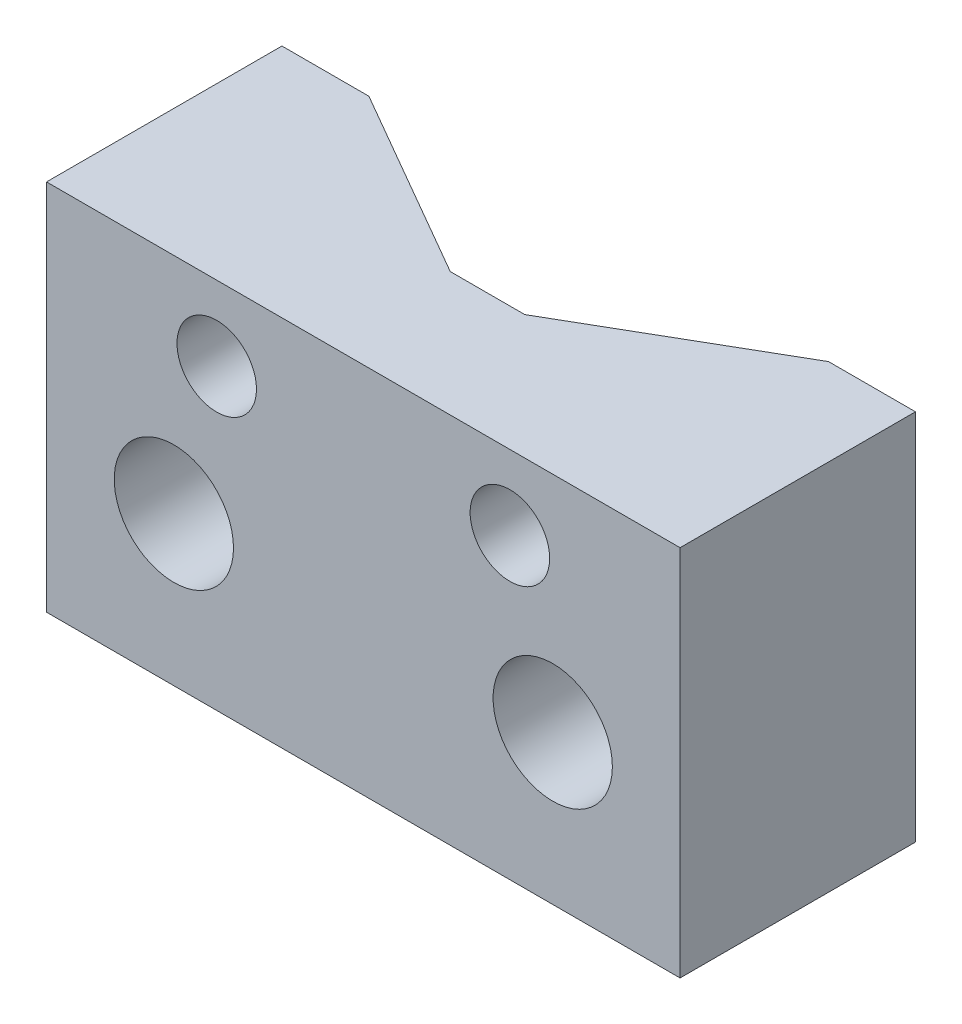
ISO-10303-21;
HEADER;
FILE_DESCRIPTION(('STEP AP214'),'2;1');
FILE_NAME('part.step','',(''),(''),'','','');
FILE_SCHEMA(('AUTOMOTIVE_DESIGN { 1 0 10303 214 1 1 1 1 }'));
ENDSEC;
DATA;
#1=APPLICATION_CONTEXT('core data for automotive mechanical design processes');
#2=APPLICATION_PROTOCOL_DEFINITION('international standard','automotive_design',2000,#1);
#3=PRODUCT_CONTEXT('',#1,'mechanical');
#4=PRODUCT('Part','Part','',(#3));
#5=PRODUCT_RELATED_PRODUCT_CATEGORY('part','',(#4));
#6=PRODUCT_DEFINITION_FORMATION('','',#4);
#7=PRODUCT_DEFINITION_CONTEXT('part definition',#1,'design');
#8=PRODUCT_DEFINITION('design','',#6,#7);
#9=PRODUCT_DEFINITION_SHAPE('','',#8);
#10=(LENGTH_UNIT() NAMED_UNIT(*) SI_UNIT(.MILLI.,.METRE.));
#11=(NAMED_UNIT(*) PLANE_ANGLE_UNIT() SI_UNIT($,.RADIAN.));
#12=(NAMED_UNIT(*) SI_UNIT($,.STERADIAN.) SOLID_ANGLE_UNIT());
#13=UNCERTAINTY_MEASURE_WITH_UNIT(LENGTH_MEASURE(1.E-05),#10,'distance_accuracy_value','');
#14=(GEOMETRIC_REPRESENTATION_CONTEXT(3) GLOBAL_UNCERTAINTY_ASSIGNED_CONTEXT((#13)) GLOBAL_UNIT_ASSIGNED_CONTEXT((#10,
#11,#12)) REPRESENTATION_CONTEXT('',''));
#15=CARTESIAN_POINT('',(0.,0.,0.));
#16=DIRECTION('',(0.,0.,1.));
#17=DIRECTION('',(1.,0.,0.));
#18=AXIS2_PLACEMENT_3D('',#15,#16,#17);
#19=CARTESIAN_POINT('',(12.75,15.,-9.47446458621961));
#20=DIRECTION('',(-1.,0.,0.));
#21=DIRECTION('',(0.,0.,1.));
#22=AXIS2_PLACEMENT_3D('',#19,#20,#21);
#23=PLANE('',#22);
#24=DIRECTION('',(0.,0.,-1.));
#25=VECTOR('',#24,1.);
#26=CARTESIAN_POINT('',(12.75,0.,-9.47446458621961));
#27=LINE('',#26,#25);
#28=CARTESIAN_POINT('',(12.75,0.,0.));
#29=VERTEX_POINT('',#28);
#30=CARTESIAN_POINT('',(12.75,0.,-9.47446458621961));
#31=VERTEX_POINT('',#30);
#32=EDGE_CURVE('E158',#29,#31,#27,.T.);
#33=ORIENTED_EDGE('',*,*,#32,.T.);
#34=DIRECTION('',(0.,-1.,0.));
#35=VECTOR('',#34,1.);
#36=CARTESIAN_POINT('',(12.75,15.,-9.47446458621961));
#37=LINE('',#36,#35);
#38=CARTESIAN_POINT('',(12.75,15.,-9.47446458621961));
#39=VERTEX_POINT('',#38);
#40=EDGE_CURVE('E40',#39,#31,#37,.T.);
#41=ORIENTED_EDGE('',*,*,#40,.F.);
#42=DIRECTION('',(0.,0.,-1.));
#43=VECTOR('',#42,1.);
#44=CARTESIAN_POINT('',(12.75,15.,-9.47446458621961));
#45=LINE('',#44,#43);
#46=CARTESIAN_POINT('',(12.75,15.,0.));
#47=VERTEX_POINT('',#46);
#48=EDGE_CURVE('E195',#47,#39,#45,.T.);
#49=ORIENTED_EDGE('',*,*,#48,.F.);
#50=DIRECTION('',(0.,-1.,0.));
#51=VECTOR('',#50,1.);
#52=CARTESIAN_POINT('',(12.75,15.,0.));
#53=LINE('',#52,#51);
#54=EDGE_CURVE('E11',#47,#29,#53,.T.);
#55=ORIENTED_EDGE('',*,*,#54,.T.);
#56=EDGE_LOOP('',(#33,#41,#49,#55));
#57=FACE_BOUND('',#56,.T.);
#58=ADVANCED_FACE('F33',(#57),#23,.F.);
#59=CARTESIAN_POINT('',(9.25,15.,-9.47446458621961));
#60=DIRECTION('',(0.,0.,1.));
#61=DIRECTION('',(1.,0.,0.));
#62=AXIS2_PLACEMENT_3D('',#59,#60,#61);
#63=PLANE('',#62);
#64=DIRECTION('',(0.,-1.,0.));
#65=VECTOR('',#64,1.);
#66=CARTESIAN_POINT('',(9.25,15.,-9.47446458621961));
#67=LINE('',#66,#65);
#68=CARTESIAN_POINT('',(9.25,4.233824753882,-9.47446458621961));
#69=VERTEX_POINT('',#68);
#70=CARTESIAN_POINT('',(9.25,0.,-9.47446458621961));
#71=VERTEX_POINT('',#70);
#72=EDGE_CURVE('E137',#69,#71,#67,.T.);
#73=ORIENTED_EDGE('',*,*,#72,.F.);
#74=CARTESIAN_POINT('',(7.625,6.,-9.47446458621961));
#75=DIRECTION('',(0.,0.,1.));
#76=DIRECTION('',(1.,0.,0.));
#77=AXIS2_PLACEMENT_3D('',#74,#75,#76);
#78=CIRCLE('',#77,2.4);
#79=CARTESIAN_POINT('',(9.25,7.766175246118,-9.47446458621961));
#80=VERTEX_POINT('',#79);
#81=EDGE_CURVE('E46',#69,#80,#78,.T.);
#82=ORIENTED_EDGE('',*,*,#81,.T.);
#83=CARTESIAN_POINT('',(9.25,15.,-9.47446458621961));
#84=VERTEX_POINT('',#83);
#85=EDGE_CURVE('E138',#84,#80,#67,.T.);
#86=ORIENTED_EDGE('',*,*,#85,.F.);
#87=DIRECTION('',(-1.,0.,0.));
#88=VECTOR('',#87,1.);
#89=CARTESIAN_POINT('',(9.25,15.,-9.47446458621961));
#90=LINE('',#89,#88);
#91=EDGE_CURVE('E151',#39,#84,#90,.T.);
#92=ORIENTED_EDGE('',*,*,#91,.F.);
#93=ORIENTED_EDGE('',*,*,#40,.T.);
#94=DIRECTION('',(-1.,0.,0.));
#95=VECTOR('',#94,1.);
#96=CARTESIAN_POINT('',(9.25,0.,-9.47446458621961));
#97=LINE('',#96,#95);
#98=EDGE_CURVE('E148',#31,#71,#97,.T.);
#99=ORIENTED_EDGE('',*,*,#98,.T.);
#100=EDGE_LOOP('',(#73,#82,#86,#92,#93,#99));
#101=FACE_BOUND('',#100,.T.);
#102=ADVANCED_FACE('F147',(#101),#63,.F.);
#103=CARTESIAN_POINT('',(1.5,15.,-5.));
#104=DIRECTION('',(0.500000000000001,0.,0.866025403784438));
#105=DIRECTION('',(0.866025403784438,0.,-0.500000000000001));
#106=AXIS2_PLACEMENT_3D('',#103,#104,#105);
#107=PLANE('',#106);
#108=CARTESIAN_POINT('',(5.9,12.,-7.54034118443436));
#109=DIRECTION('',(0.500000000000001,0.,0.866025403784438));
#110=DIRECTION('',(-0.866025403784438,0.,0.500000000000001));
#111=AXIS2_PLACEMENT_3D('',#108,#109,#110);
#112=ELLIPSE('',#111,1.8475208614068,1.6);
#113=CARTESIAN_POINT('',(4.3,12.,-6.61658075373095));
#114=VERTEX_POINT('',#113);
#115=EDGE_CURVE('E199',#114,#114,#112,.T.);
#116=ORIENTED_EDGE('',*,*,#115,.T.);
#117=EDGE_LOOP('',(#116));
#118=FACE_BOUND('',#117,.T.);
#119=ORIENTED_EDGE('',*,*,#85,.T.);
#120=CARTESIAN_POINT('',(7.625,6.,-8.53627039878647));
#121=DIRECTION('',(0.500000000000001,0.,0.866025403784438));
#122=DIRECTION('',(-0.866025403784438,0.,0.500000000000001));
#123=AXIS2_PLACEMENT_3D('',#120,#121,#122);
#124=ELLIPSE('',#123,2.7712812921102,2.4);
#125=EDGE_CURVE('E164',#80,#69,#124,.T.);
#126=ORIENTED_EDGE('',*,*,#125,.T.);
#127=ORIENTED_EDGE('',*,*,#72,.T.);
#128=DIRECTION('',(-0.866025403784438,0.,0.500000000000001));
#129=VECTOR('',#128,1.);
#130=CARTESIAN_POINT('',(1.5,0.,-5.));
#131=LINE('',#130,#129);
#132=CARTESIAN_POINT('',(1.5,0.,-5.));
#133=VERTEX_POINT('',#132);
#134=EDGE_CURVE('E160',#71,#133,#131,.T.);
#135=ORIENTED_EDGE('',*,*,#134,.T.);
#136=DIRECTION('',(0.,-1.,0.));
#137=VECTOR('',#136,1.);
#138=CARTESIAN_POINT('',(1.5,15.,-5.));
#139=LINE('',#138,#137);
#140=CARTESIAN_POINT('',(1.5,15.,-5.));
#141=VERTEX_POINT('',#140);
#142=EDGE_CURVE('E129',#141,#133,#139,.T.);
#143=ORIENTED_EDGE('',*,*,#142,.F.);
#144=DIRECTION('',(-0.866025403784438,0.,0.500000000000001));
#145=VECTOR('',#144,1.);
#146=CARTESIAN_POINT('',(1.5,15.,-5.));
#147=LINE('',#146,#145);
#148=EDGE_CURVE('E192',#84,#141,#147,.T.);
#149=ORIENTED_EDGE('',*,*,#148,.F.);
#150=EDGE_LOOP('',(#119,#126,#127,#135,#143,#149));
#151=FACE_BOUND('',#150,.T.);
#152=ADVANCED_FACE('F233',(#118,#151),#107,.F.);
#153=CARTESIAN_POINT('',(0.,15.,-5.));
#154=DIRECTION('',(0.,0.,1.));
#155=DIRECTION('',(1.,0.,0.));
#156=AXIS2_PLACEMENT_3D('',#153,#154,#155);
#157=PLANE('',#156);
#158=DIRECTION('',(-1.,0.,0.));
#159=VECTOR('',#158,1.);
#160=CARTESIAN_POINT('',(0.,0.,-5.));
#161=LINE('',#160,#159);
#162=CARTESIAN_POINT('',(-1.5,0.,-5.));
#163=VERTEX_POINT('',#162);
#164=EDGE_CURVE('E162',#133,#163,#161,.T.);
#165=ORIENTED_EDGE('',*,*,#164,.T.);
#166=DIRECTION('',(0.,-1.,0.));
#167=VECTOR('',#166,1.);
#168=CARTESIAN_POINT('',(-1.5,15.,-5.));
#169=LINE('',#168,#167);
#170=CARTESIAN_POINT('',(-1.5,15.,-5.));
#171=VERTEX_POINT('',#170);
#172=EDGE_CURVE('E126',#171,#163,#169,.T.);
#173=ORIENTED_EDGE('',*,*,#172,.F.);
#174=DIRECTION('',(-1.,0.,0.));
#175=VECTOR('',#174,1.);
#176=CARTESIAN_POINT('',(0.,15.,-5.));
#177=LINE('',#176,#175);
#178=EDGE_CURVE('E190',#141,#171,#177,.T.);
#179=ORIENTED_EDGE('',*,*,#178,.F.);
#180=ORIENTED_EDGE('',*,*,#142,.T.);
#181=EDGE_LOOP('',(#165,#173,#179,#180));
#182=FACE_BOUND('',#181,.T.);
#183=ADVANCED_FACE('F237',(#182),#157,.F.);
#184=CARTESIAN_POINT('',(-1.5,15.,-5.));
#185=DIRECTION('',(-0.500000000000001,0.,0.866025403784438));
#186=DIRECTION('',(0.866025403784438,0.,0.500000000000001));
#187=AXIS2_PLACEMENT_3D('',#184,#185,#186);
#188=PLANE('',#187);
#189=CARTESIAN_POINT('',(-5.90000000000001,12.,-7.54034118443436));
#190=DIRECTION('',(-0.500000000000001,0.,0.866025403784438));
#191=DIRECTION('',(0.866025403784438,0.,0.500000000000001));
#192=AXIS2_PLACEMENT_3D('',#189,#190,#191);
#193=ELLIPSE('',#192,1.8475208614068,1.6);
#194=CARTESIAN_POINT('',(-4.30000000000001,12.,-6.61658075373096));
#195=VERTEX_POINT('',#194);
#196=EDGE_CURVE('E121',#195,#195,#193,.T.);
#197=ORIENTED_EDGE('',*,*,#196,.T.);
#198=EDGE_LOOP('',(#197));
#199=FACE_BOUND('',#198,.T.);
#200=DIRECTION('',(0.,-1.,0.));
#201=VECTOR('',#200,1.);
#202=CARTESIAN_POINT('',(-9.25,15.,-9.47446458621961));
#203=LINE('',#202,#201);
#204=CARTESIAN_POINT('',(-9.25,4.23382475388199,-9.47446458621961));
#205=VERTEX_POINT('',#204);
#206=CARTESIAN_POINT('',(-9.25,0.,-9.47446458621961));
#207=VERTEX_POINT('',#206);
#208=EDGE_CURVE('E120',#205,#207,#203,.T.);
#209=ORIENTED_EDGE('',*,*,#208,.F.);
#210=CARTESIAN_POINT('',(-7.625,6.,-8.53627039878647));
#211=DIRECTION('',(-0.500000000000001,0.,0.866025403784438));
#212=DIRECTION('',(0.866025403784438,0.,0.500000000000001));
#213=AXIS2_PLACEMENT_3D('',#210,#211,#212);
#214=ELLIPSE('',#213,2.7712812921102,2.4);
#215=CARTESIAN_POINT('',(-9.25,7.766175246118,-9.47446458621961));
#216=VERTEX_POINT('',#215);
#217=EDGE_CURVE('E53',#205,#216,#214,.T.);
#218=ORIENTED_EDGE('',*,*,#217,.T.);
#219=CARTESIAN_POINT('',(-9.25,15.,-9.47446458621961));
#220=VERTEX_POINT('',#219);
#221=EDGE_CURVE('E117',#220,#216,#203,.T.);
#222=ORIENTED_EDGE('',*,*,#221,.F.);
#223=DIRECTION('',(-0.866025403784438,0.,-0.500000000000001));
#224=VECTOR('',#223,1.);
#225=CARTESIAN_POINT('',(-1.5,15.,-5.));
#226=LINE('',#225,#224);
#227=EDGE_CURVE('E186',#171,#220,#226,.T.);
#228=ORIENTED_EDGE('',*,*,#227,.F.);
#229=ORIENTED_EDGE('',*,*,#172,.T.);
#230=DIRECTION('',(-0.866025403784438,0.,-0.500000000000001));
#231=VECTOR('',#230,1.);
#232=CARTESIAN_POINT('',(-1.5,0.,-5.));
#233=LINE('',#232,#231);
#234=EDGE_CURVE('E169',#163,#207,#233,.T.);
#235=ORIENTED_EDGE('',*,*,#234,.T.);
#236=EDGE_LOOP('',(#209,#218,#222,#228,#229,#235));
#237=FACE_BOUND('',#236,.T.);
#238=ADVANCED_FACE('F115',(#199,#237),#188,.F.);
#239=CARTESIAN_POINT('',(-9.25,15.,-9.47446458621961));
#240=DIRECTION('',(0.,0.,1.));
#241=DIRECTION('',(1.,0.,0.));
#242=AXIS2_PLACEMENT_3D('',#239,#240,#241);
#243=PLANE('',#242);
#244=ORIENTED_EDGE('',*,*,#221,.T.);
#245=CARTESIAN_POINT('',(-7.625,6.,-9.47446458621961));
#246=DIRECTION('',(0.,0.,1.));
#247=DIRECTION('',(1.,0.,0.));
#248=AXIS2_PLACEMENT_3D('',#245,#246,#247);
#249=CIRCLE('',#248,2.4);
#250=EDGE_CURVE('E106',#216,#205,#249,.T.);
#251=ORIENTED_EDGE('',*,*,#250,.T.);
#252=ORIENTED_EDGE('',*,*,#208,.T.);
#253=DIRECTION('',(-1.,0.,0.));
#254=VECTOR('',#253,1.);
#255=CARTESIAN_POINT('',(-9.25,0.,-9.47446458621961));
#256=LINE('',#255,#254);
#257=CARTESIAN_POINT('',(-12.75,0.,-9.47446458621961));
#258=VERTEX_POINT('',#257);
#259=EDGE_CURVE('E171',#207,#258,#256,.T.);
#260=ORIENTED_EDGE('',*,*,#259,.T.);
#261=DIRECTION('',(0.,-1.,0.));
#262=VECTOR('',#261,1.);
#263=CARTESIAN_POINT('',(-12.75,15.,-9.47446458621961));
#264=LINE('',#263,#262);
#265=CARTESIAN_POINT('',(-12.75,15.,-9.47446458621961));
#266=VERTEX_POINT('',#265);
#267=EDGE_CURVE('E131',#266,#258,#264,.T.);
#268=ORIENTED_EDGE('',*,*,#267,.F.);
#269=DIRECTION('',(-1.,0.,0.));
#270=VECTOR('',#269,1.);
#271=CARTESIAN_POINT('',(-9.25,15.,-9.47446458621961));
#272=LINE('',#271,#270);
#273=EDGE_CURVE('E125',#220,#266,#272,.T.);
#274=ORIENTED_EDGE('',*,*,#273,.F.);
#275=EDGE_LOOP('',(#244,#251,#252,#260,#268,#274));
#276=FACE_BOUND('',#275,.T.);
#277=ADVANCED_FACE('F123',(#276),#243,.F.);
#278=CARTESIAN_POINT('',(-12.75,15.,-9.47446458621961));
#279=DIRECTION('',(1.,0.,0.));
#280=DIRECTION('',(0.,0.,-1.));
#281=AXIS2_PLACEMENT_3D('',#278,#279,#280);
#282=PLANE('',#281);
#283=DIRECTION('',(0.,0.,1.));
#284=VECTOR('',#283,1.);
#285=CARTESIAN_POINT('',(-12.75,0.,-9.47446458621961));
#286=LINE('',#285,#284);
#287=CARTESIAN_POINT('',(-12.75,0.,0.));
#288=VERTEX_POINT('',#287);
#289=EDGE_CURVE('E173',#258,#288,#286,.T.);
#290=ORIENTED_EDGE('',*,*,#289,.T.);
#291=DIRECTION('',(0.,-1.,0.));
#292=VECTOR('',#291,1.);
#293=CARTESIAN_POINT('',(-12.75,15.,0.));
#294=LINE('',#293,#292);
#295=CARTESIAN_POINT('',(-12.75,15.,0.));
#296=VERTEX_POINT('',#295);
#297=EDGE_CURVE('E177',#296,#288,#294,.T.);
#298=ORIENTED_EDGE('',*,*,#297,.F.);
#299=DIRECTION('',(0.,0.,1.));
#300=VECTOR('',#299,1.);
#301=CARTESIAN_POINT('',(-12.75,15.,-9.47446458621961));
#302=LINE('',#301,#300);
#303=EDGE_CURVE('E179',#266,#296,#302,.T.);
#304=ORIENTED_EDGE('',*,*,#303,.F.);
#305=ORIENTED_EDGE('',*,*,#267,.T.);
#306=EDGE_LOOP('',(#290,#298,#304,#305));
#307=FACE_BOUND('',#306,.T.);
#308=ADVANCED_FACE('F224',(#307),#282,.F.);
#309=CARTESIAN_POINT('',(-10.25,15.,0.));
#310=DIRECTION('',(0.,0.,-1.));
#311=DIRECTION('',(-1.,0.,0.));
#312=AXIS2_PLACEMENT_3D('',#309,#310,#311);
#313=PLANE('',#312);
#314=CARTESIAN_POINT('',(7.625,6.,0.));
#315=DIRECTION('',(0.,0.,1.));
#316=DIRECTION('',(1.,0.,0.));
#317=AXIS2_PLACEMENT_3D('',#314,#315,#316);
#318=CIRCLE('',#317,2.4);
#319=CARTESIAN_POINT('',(10.025,6.,0.));
#320=VERTEX_POINT('',#319);
#321=EDGE_CURVE('E207',#320,#320,#318,.T.);
#322=ORIENTED_EDGE('',*,*,#321,.F.);
#323=EDGE_LOOP('',(#322));
#324=FACE_BOUND('',#323,.T.);
#325=CARTESIAN_POINT('',(5.9,12.,0.));
#326=DIRECTION('',(0.,0.,1.));
#327=DIRECTION('',(1.,0.,0.));
#328=AXIS2_PLACEMENT_3D('',#325,#326,#327);
#329=CIRCLE('',#328,1.6);
#330=CARTESIAN_POINT('',(7.5,12.,0.));
#331=VERTEX_POINT('',#330);
#332=EDGE_CURVE('E211',#331,#331,#329,.T.);
#333=ORIENTED_EDGE('',*,*,#332,.F.);
#334=EDGE_LOOP('',(#333));
#335=FACE_BOUND('',#334,.T.);
#336=CARTESIAN_POINT('',(-5.90000000000001,12.,0.));
#337=DIRECTION('',(0.,0.,1.));
#338=DIRECTION('',(1.,0.,0.));
#339=AXIS2_PLACEMENT_3D('',#336,#337,#338);
#340=CIRCLE('',#339,1.6);
#341=CARTESIAN_POINT('',(-4.30000000000001,12.,0.));
#342=VERTEX_POINT('',#341);
#343=EDGE_CURVE('E205',#342,#342,#340,.T.);
#344=ORIENTED_EDGE('',*,*,#343,.F.);
#345=EDGE_LOOP('',(#344));
#346=FACE_BOUND('',#345,.T.);
#347=CARTESIAN_POINT('',(-7.625,6.,0.));
#348=DIRECTION('',(0.,0.,1.));
#349=DIRECTION('',(1.,0.,0.));
#350=AXIS2_PLACEMENT_3D('',#347,#348,#349);
#351=CIRCLE('',#350,2.4);
#352=CARTESIAN_POINT('',(-5.225,6.,0.));
#353=VERTEX_POINT('',#352);
#354=EDGE_CURVE('E111',#353,#353,#351,.T.);
#355=ORIENTED_EDGE('',*,*,#354,.F.);
#356=EDGE_LOOP('',(#355));
#357=FACE_BOUND('',#356,.T.);
#358=DIRECTION('',(1.,0.,0.));
#359=VECTOR('',#358,1.);
#360=CARTESIAN_POINT('',(-10.25,0.,0.));
#361=LINE('',#360,#359);
#362=EDGE_CURVE('E175',#288,#29,#361,.T.);
#363=ORIENTED_EDGE('',*,*,#362,.T.);
#364=ORIENTED_EDGE('',*,*,#54,.F.);
#365=DIRECTION('',(1.,0.,0.));
#366=VECTOR('',#365,1.);
#367=CARTESIAN_POINT('',(0.,15.,0.));
#368=LINE('',#367,#366);
#369=EDGE_CURVE('E176',#296,#47,#368,.T.);
#370=ORIENTED_EDGE('',*,*,#369,.F.);
#371=ORIENTED_EDGE('',*,*,#297,.T.);
#372=EDGE_LOOP('',(#363,#364,#370,#371));
#373=FACE_BOUND('',#372,.T.);
#374=ADVANCED_FACE('F220',(#324,#335,#346,#357,#373),#313,.F.);
#375=CARTESIAN_POINT('',(0.,15.,0.));
#376=DIRECTION('',(0.,1.,0.));
#377=DIRECTION('',(0.,0.,1.));
#378=AXIS2_PLACEMENT_3D('',#375,#376,#377);
#379=PLANE('',#378);
#380=ORIENTED_EDGE('',*,*,#369,.T.);
#381=ORIENTED_EDGE('',*,*,#48,.T.);
#382=ORIENTED_EDGE('',*,*,#91,.T.);
#383=ORIENTED_EDGE('',*,*,#148,.T.);
#384=ORIENTED_EDGE('',*,*,#178,.T.);
#385=ORIENTED_EDGE('',*,*,#227,.T.);
#386=ORIENTED_EDGE('',*,*,#273,.T.);
#387=ORIENTED_EDGE('',*,*,#303,.T.);
#388=EDGE_LOOP('',(#380,#381,#382,#383,#384,#385,#386,#387));
#389=FACE_BOUND('',#388,.T.);
#390=ADVANCED_FACE('F223',(#389),#379,.T.);
#391=CARTESIAN_POINT('',(0.,0.,0.));
#392=DIRECTION('',(0.,1.,0.));
#393=DIRECTION('',(0.,0.,1.));
#394=AXIS2_PLACEMENT_3D('',#391,#392,#393);
#395=PLANE('',#394);
#396=ORIENTED_EDGE('',*,*,#32,.F.);
#397=ORIENTED_EDGE('',*,*,#362,.F.);
#398=ORIENTED_EDGE('',*,*,#289,.F.);
#399=ORIENTED_EDGE('',*,*,#259,.F.);
#400=ORIENTED_EDGE('',*,*,#234,.F.);
#401=ORIENTED_EDGE('',*,*,#164,.F.);
#402=ORIENTED_EDGE('',*,*,#134,.F.);
#403=ORIENTED_EDGE('',*,*,#98,.F.);
#404=EDGE_LOOP('',(#396,#397,#398,#399,#400,#401,#402,#403));
#405=FACE_BOUND('',#404,.T.);
#406=ADVANCED_FACE('F156',(#405),#395,.F.);
#407=CARTESIAN_POINT('',(-7.625,6.,-9.47446458621961));
#408=DIRECTION('',(0.,0.,1.));
#409=DIRECTION('',(1.,0.,0.));
#410=AXIS2_PLACEMENT_3D('',#407,#408,#409);
#411=CYLINDRICAL_SURFACE('',#410,2.4);
#412=ORIENTED_EDGE('',*,*,#354,.T.);
#413=EDGE_LOOP('',(#412));
#414=FACE_BOUND('',#413,.T.);
#415=ORIENTED_EDGE('',*,*,#250,.F.);
#416=ORIENTED_EDGE('',*,*,#217,.F.);
#417=EDGE_LOOP('',(#415,#416));
#418=FACE_BOUND('',#417,.T.);
#419=ADVANCED_FACE('F107',(#414,#418),#411,.F.);
#420=CARTESIAN_POINT('',(-5.90000000000001,12.,-9.47446458621961));
#421=DIRECTION('',(0.,0.,1.));
#422=DIRECTION('',(1.,0.,0.));
#423=AXIS2_PLACEMENT_3D('',#420,#421,#422);
#424=CYLINDRICAL_SURFACE('',#423,1.6);
#425=ORIENTED_EDGE('',*,*,#343,.T.);
#426=EDGE_LOOP('',(#425));
#427=FACE_BOUND('',#426,.T.);
#428=ORIENTED_EDGE('',*,*,#196,.F.);
#429=EDGE_LOOP('',(#428));
#430=FACE_BOUND('',#429,.T.);
#431=ADVANCED_FACE('F217',(#427,#430),#424,.F.);
#432=CARTESIAN_POINT('',(5.9,12.,-9.47446458621961));
#433=DIRECTION('',(0.,0.,1.));
#434=DIRECTION('',(1.,0.,0.));
#435=AXIS2_PLACEMENT_3D('',#432,#433,#434);
#436=CYLINDRICAL_SURFACE('',#435,1.6);
#437=ORIENTED_EDGE('',*,*,#332,.T.);
#438=EDGE_LOOP('',(#437));
#439=FACE_BOUND('',#438,.T.);
#440=ORIENTED_EDGE('',*,*,#115,.F.);
#441=EDGE_LOOP('',(#440));
#442=FACE_BOUND('',#441,.T.);
#443=ADVANCED_FACE('F265',(#439,#442),#436,.F.);
#444=CARTESIAN_POINT('',(7.625,6.,-9.47446458621961));
#445=DIRECTION('',(0.,0.,1.));
#446=DIRECTION('',(1.,0.,0.));
#447=AXIS2_PLACEMENT_3D('',#444,#445,#446);
#448=CYLINDRICAL_SURFACE('',#447,2.4);
#449=ORIENTED_EDGE('',*,*,#321,.T.);
#450=EDGE_LOOP('',(#449));
#451=FACE_BOUND('',#450,.T.);
#452=ORIENTED_EDGE('',*,*,#81,.F.);
#453=ORIENTED_EDGE('',*,*,#125,.F.);
#454=EDGE_LOOP('',(#452,#453));
#455=FACE_BOUND('',#454,.T.);
#456=ADVANCED_FACE('F271',(#451,#455),#448,.F.);
#457=CLOSED_SHELL('',(#58,#102,#152,#183,#238,#277,#308,#374,#390,#406,#419,#431,#443,#456));
#458=MANIFOLD_SOLID_BREP('B2',#457);
#459=ADVANCED_BREP_SHAPE_REPRESENTATION('',(#18,#458),#14);
#460=SHAPE_DEFINITION_REPRESENTATION(#9,#459);
ENDSEC;
END-ISO-10303-21;
